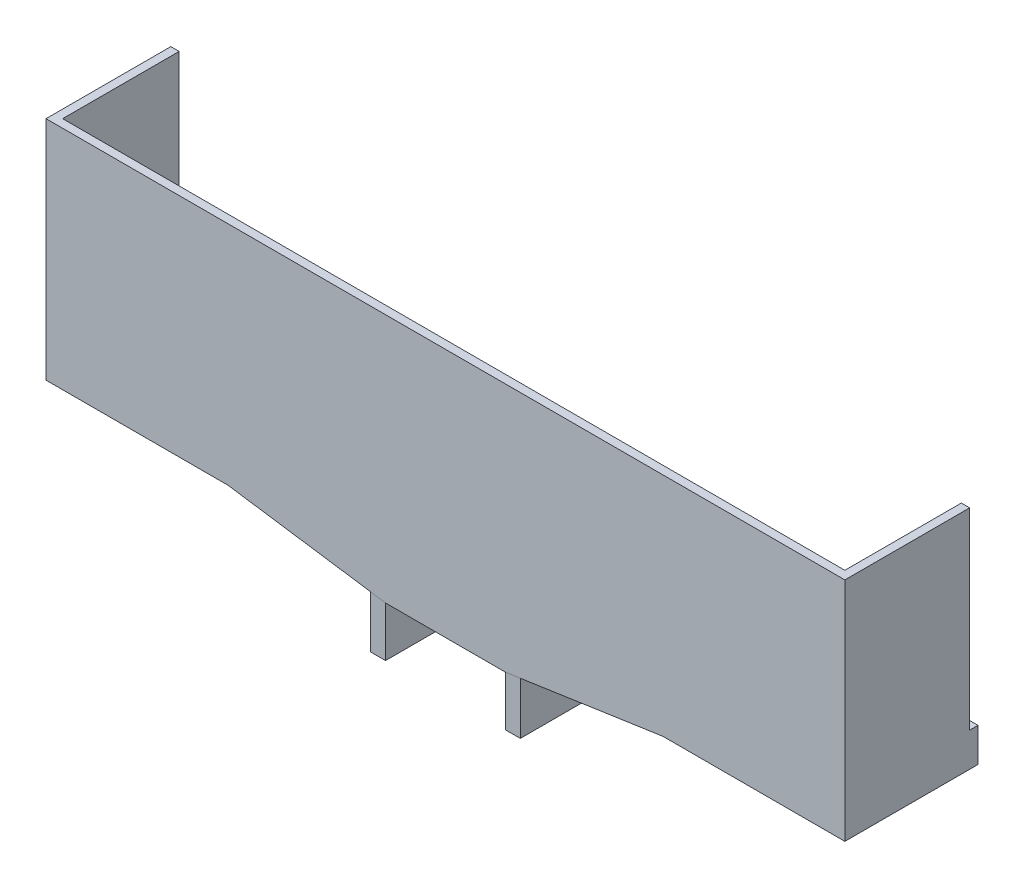
ISO-10303-21;
HEADER;
FILE_DESCRIPTION(('STEP AP214'),'2;1');
FILE_NAME('part.step','',(''),(''),'','','');
FILE_SCHEMA(('AUTOMOTIVE_DESIGN { 1 0 10303 214 1 1 1 1 }'));
ENDSEC;
DATA;
#1=APPLICATION_CONTEXT('core data for automotive mechanical design processes');
#2=APPLICATION_PROTOCOL_DEFINITION('international standard','automotive_design',2000,#1);
#3=PRODUCT_CONTEXT('',#1,'mechanical');
#4=PRODUCT('Part','Part','',(#3));
#5=PRODUCT_RELATED_PRODUCT_CATEGORY('part','',(#4));
#6=PRODUCT_DEFINITION_FORMATION('','',#4);
#7=PRODUCT_DEFINITION_CONTEXT('part definition',#1,'design');
#8=PRODUCT_DEFINITION('design','',#6,#7);
#9=PRODUCT_DEFINITION_SHAPE('','',#8);
#10=(LENGTH_UNIT() NAMED_UNIT(*) SI_UNIT(.MILLI.,.METRE.));
#11=(NAMED_UNIT(*) PLANE_ANGLE_UNIT() SI_UNIT($,.RADIAN.));
#12=(NAMED_UNIT(*) SI_UNIT($,.STERADIAN.) SOLID_ANGLE_UNIT());
#13=UNCERTAINTY_MEASURE_WITH_UNIT(LENGTH_MEASURE(1.E-05),#10,'distance_accuracy_value','');
#14=(GEOMETRIC_REPRESENTATION_CONTEXT(3) GLOBAL_UNCERTAINTY_ASSIGNED_CONTEXT((#13)) GLOBAL_UNIT_ASSIGNED_CONTEXT((#10,
#11,#12)) REPRESENTATION_CONTEXT('',''));
#15=CARTESIAN_POINT('',(0.,0.,0.));
#16=DIRECTION('',(0.,0.,1.));
#17=DIRECTION('',(1.,0.,0.));
#18=AXIS2_PLACEMENT_3D('',#15,#16,#17);
#19=CARTESIAN_POINT('',(240.,30.,80.));
#20=DIRECTION('',(-0.145493990494832,0.989359135364853,0.));
#21=DIRECTION('',(-0.989359135364853,-0.145493990494832,0.));
#22=AXIS2_PLACEMENT_3D('',#19,#20,#21);
#23=PLANE('',#22);
#24=DIRECTION('',(0.,0.,-1.));
#25=VECTOR('',#24,1.);
#26=CARTESIAN_POINT('',(36.,0.,0.));
#27=LINE('',#26,#25);
#28=CARTESIAN_POINT('',(36.,0.,80.));
#29=VERTEX_POINT('',#28);
#30=CARTESIAN_POINT('',(36.,0.,40.));
#31=VERTEX_POINT('',#30);
#32=EDGE_CURVE('E104',#29,#31,#27,.T.);
#33=ORIENTED_EDGE('',*,*,#32,.F.);
#34=DIRECTION('',(0.989359135364853,0.145493990494832,0.));
#35=VECTOR('',#34,1.);
#36=CARTESIAN_POINT('',(22.3542252328534,-2.00673158340392,80.));
#37=LINE('',#36,#35);
#38=CARTESIAN_POINT('',(45.,1.32352941176474,80.));
#39=VERTEX_POINT('',#38);
#40=EDGE_CURVE('E12',#29,#39,#37,.T.);
#41=ORIENTED_EDGE('',*,*,#40,.T.);
#42=DIRECTION('',(0.,0.,-1.));
#43=VECTOR('',#42,1.);
#44=CARTESIAN_POINT('',(45.,1.3235294117647,0.));
#45=LINE('',#44,#43);
#46=CARTESIAN_POINT('',(45.,1.32352941176475,40.));
#47=VERTEX_POINT('',#46);
#48=EDGE_CURVE('E53',#39,#47,#45,.T.);
#49=ORIENTED_EDGE('',*,*,#48,.T.);
#50=DIRECTION('',(0.989359135364853,0.145493990494832,0.));
#51=VECTOR('',#50,1.);
#52=CARTESIAN_POINT('',(22.3542252328535,-2.00673158340392,40.));
#53=LINE('',#52,#51);
#54=EDGE_CURVE('E48',#31,#47,#53,.T.);
#55=ORIENTED_EDGE('',*,*,#54,.F.);
#56=EDGE_LOOP('',(#33,#41,#49,#55));
#57=FACE_BOUND('',#56,.T.);
#58=ADVANCED_FACE('F45',(#57),#23,.T.);
#59=CARTESIAN_POINT('',(-1.50463529560101E-13,150.002,79.9999999999999));
#60=DIRECTION('',(0.,0.,-1.));
#61=DIRECTION('',(-1.,0.,0.));
#62=AXIS2_PLACEMENT_3D('',#59,#60,#61);
#63=PLANE('',#62);
#64=ORIENTED_EDGE('',*,*,#40,.F.);
#65=DIRECTION('',(0.,1.,0.));
#66=VECTOR('',#65,1.);
#67=CARTESIAN_POINT('',(36.,-30.,80.));
#68=LINE('',#67,#66);
#69=CARTESIAN_POINT('',(36.,-30.,80.));
#70=VERTEX_POINT('',#69);
#71=EDGE_CURVE('E105',#70,#29,#68,.T.);
#72=ORIENTED_EDGE('',*,*,#71,.F.);
#73=DIRECTION('',(1.,0.,0.));
#74=VECTOR('',#73,1.);
#75=CARTESIAN_POINT('',(-1.17937102984812E-13,-30.,79.9999999999999));
#76=LINE('',#75,#74);
#77=CARTESIAN_POINT('',(45.,-30.,80.));
#78=VERTEX_POINT('',#77);
#79=EDGE_CURVE('E99',#70,#78,#76,.T.);
#80=ORIENTED_EDGE('',*,*,#79,.T.);
#81=DIRECTION('',(0.,-1.,0.));
#82=VECTOR('',#81,1.);
#83=CARTESIAN_POINT('',(45.,150.002,80.));
#84=LINE('',#83,#82);
#85=EDGE_CURVE('E107',#39,#78,#84,.T.);
#86=ORIENTED_EDGE('',*,*,#85,.F.);
#87=EDGE_LOOP('',(#64,#72,#80,#86));
#88=FACE_BOUND('',#87,.T.);
#89=ADVANCED_FACE('F119',(#88),#63,.F.);
#90=CARTESIAN_POINT('',(44.9999999999999,150.002,0.));
#91=DIRECTION('',(-1.,0.,0.));
#92=DIRECTION('',(0.,0.,1.));
#93=AXIS2_PLACEMENT_3D('',#90,#91,#92);
#94=PLANE('',#93);
#95=ORIENTED_EDGE('',*,*,#48,.F.);
#96=ORIENTED_EDGE('',*,*,#85,.T.);
#97=DIRECTION('',(0.,0.,-1.));
#98=VECTOR('',#97,1.);
#99=CARTESIAN_POINT('',(45.,-30.,0.));
#100=LINE('',#99,#98);
#101=CARTESIAN_POINT('',(45.,-30.,40.));
#102=VERTEX_POINT('',#101);
#103=EDGE_CURVE('E92',#78,#102,#100,.T.);
#104=ORIENTED_EDGE('',*,*,#103,.T.);
#105=DIRECTION('',(0.,-1.,0.));
#106=VECTOR('',#105,1.);
#107=CARTESIAN_POINT('',(45.,150.002,40.));
#108=LINE('',#107,#106);
#109=EDGE_CURVE('E88',#47,#102,#108,.T.);
#110=ORIENTED_EDGE('',*,*,#109,.F.);
#111=EDGE_LOOP('',(#95,#96,#104,#110));
#112=FACE_BOUND('',#111,.T.);
#113=ADVANCED_FACE('F116',(#112),#94,.F.);
#114=CARTESIAN_POINT('',(0.,150.002,39.9999999999999));
#115=DIRECTION('',(0.,0.,-1.));
#116=DIRECTION('',(-1.,0.,0.));
#117=AXIS2_PLACEMENT_3D('',#114,#115,#116);
#118=PLANE('',#117);
#119=ORIENTED_EDGE('',*,*,#109,.T.);
#120=DIRECTION('',(1.,0.,0.));
#121=VECTOR('',#120,1.);
#122=CARTESIAN_POINT('',(0.,-30.,39.9999999999999));
#123=LINE('',#122,#121);
#124=CARTESIAN_POINT('',(36.,-30.,40.));
#125=VERTEX_POINT('',#124);
#126=EDGE_CURVE('E82',#125,#102,#123,.T.);
#127=ORIENTED_EDGE('',*,*,#126,.F.);
#128=DIRECTION('',(0.,1.,0.));
#129=VECTOR('',#128,1.);
#130=CARTESIAN_POINT('',(36.,-30.,40.));
#131=LINE('',#130,#129);
#132=EDGE_CURVE('E86',#125,#31,#131,.T.);
#133=ORIENTED_EDGE('',*,*,#132,.T.);
#134=ORIENTED_EDGE('',*,*,#54,.T.);
#135=EDGE_LOOP('',(#119,#127,#133,#134));
#136=FACE_BOUND('',#135,.T.);
#137=ADVANCED_FACE('F84',(#136),#118,.T.);
#138=CARTESIAN_POINT('',(36.,-30.,0.));
#139=DIRECTION('',(1.,0.,0.));
#140=DIRECTION('',(0.,1.,0.));
#141=AXIS2_PLACEMENT_3D('',#138,#139,#140);
#142=PLANE('',#141);
#143=ORIENTED_EDGE('',*,*,#32,.T.);
#144=ORIENTED_EDGE('',*,*,#132,.F.);
#145=DIRECTION('',(0.,0.,-1.));
#146=VECTOR('',#145,1.);
#147=CARTESIAN_POINT('',(36.,-30.,0.));
#148=LINE('',#147,#146);
#149=EDGE_CURVE('E93',#70,#125,#148,.T.);
#150=ORIENTED_EDGE('',*,*,#149,.F.);
#151=ORIENTED_EDGE('',*,*,#71,.T.);
#152=EDGE_LOOP('',(#143,#144,#150,#151));
#153=FACE_BOUND('',#152,.T.);
#154=ADVANCED_FACE('F102',(#153),#142,.F.);
#155=CARTESIAN_POINT('',(0.,-30.,0.));
#156=DIRECTION('',(0.,-1.,0.));
#157=DIRECTION('',(1.,0.,0.));
#158=AXIS2_PLACEMENT_3D('',#155,#156,#157);
#159=PLANE('',#158);
#160=ORIENTED_EDGE('',*,*,#149,.T.);
#161=ORIENTED_EDGE('',*,*,#126,.T.);
#162=ORIENTED_EDGE('',*,*,#103,.F.);
#163=ORIENTED_EDGE('',*,*,#79,.F.);
#164=EDGE_LOOP('',(#160,#161,#162,#163));
#165=FACE_BOUND('',#164,.T.);
#166=ADVANCED_FACE('F97',(#165),#159,.T.);
#167=CLOSED_SHELL('',(#58,#89,#113,#137,#154,#166));
#168=MANIFOLD_SOLID_BREP('B2',#167);
#169=CARTESIAN_POINT('',(-36.,0.,80.));
#170=DIRECTION('',(0.145493990494831,0.989359135364853,0.));
#171=DIRECTION('',(-0.989359135364853,0.145493990494831,0.));
#172=AXIS2_PLACEMENT_3D('',#169,#170,#171);
#173=PLANE('',#172);
#174=DIRECTION('',(0.989359135364853,-0.145493990494831,0.));
#175=VECTOR('',#174,1.);
#176=CARTESIAN_POINT('',(-22.3542252328535,-2.00673158340386,80.));
#177=LINE('',#176,#175);
#178=CARTESIAN_POINT('',(-45.,1.32352941176475,80.));
#179=VERTEX_POINT('',#178);
#180=CARTESIAN_POINT('',(-36.,0.,80.));
#181=VERTEX_POINT('',#180);
#182=EDGE_CURVE('E191',#179,#181,#177,.T.);
#183=ORIENTED_EDGE('',*,*,#182,.T.);
#184=DIRECTION('',(0.,0.,-1.));
#185=VECTOR('',#184,1.);
#186=CARTESIAN_POINT('',(-36.,0.,0.));
#187=LINE('',#186,#185);
#188=CARTESIAN_POINT('',(-36.,0.,40.));
#189=VERTEX_POINT('',#188);
#190=EDGE_CURVE('E43',#181,#189,#187,.T.);
#191=ORIENTED_EDGE('',*,*,#190,.T.);
#192=DIRECTION('',(0.989359135364853,-0.145493990494831,0.));
#193=VECTOR('',#192,1.);
#194=CARTESIAN_POINT('',(-22.3542252328535,-2.00673158340386,40.));
#195=LINE('',#194,#193);
#196=CARTESIAN_POINT('',(-45.,1.32352941176477,40.));
#197=VERTEX_POINT('',#196);
#198=EDGE_CURVE('E251',#197,#189,#195,.T.);
#199=ORIENTED_EDGE('',*,*,#198,.F.);
#200=DIRECTION('',(0.,0.,-1.));
#201=VECTOR('',#200,1.);
#202=CARTESIAN_POINT('',(-45.,1.3235294117647,0.));
#203=LINE('',#202,#201);
#204=EDGE_CURVE('E186',#179,#197,#203,.T.);
#205=ORIENTED_EDGE('',*,*,#204,.F.);
#206=EDGE_LOOP('',(#183,#191,#199,#205));
#207=FACE_BOUND('',#206,.T.);
#208=ADVANCED_FACE('F183',(#207),#173,.T.);
#209=CARTESIAN_POINT('',(0.,150.002,40.));
#210=DIRECTION('',(0.,0.,-1.));
#211=DIRECTION('',(-1.,0.,0.));
#212=AXIS2_PLACEMENT_3D('',#209,#210,#211);
#213=PLANE('',#212);
#214=DIRECTION('',(0.,-1.,0.));
#215=VECTOR('',#214,1.);
#216=CARTESIAN_POINT('',(-45.,150.002,40.));
#217=LINE('',#216,#215);
#218=CARTESIAN_POINT('',(-45.,-30.,40.));
#219=VERTEX_POINT('',#218);
#220=EDGE_CURVE('E227',#197,#219,#217,.T.);
#221=ORIENTED_EDGE('',*,*,#220,.F.);
#222=ORIENTED_EDGE('',*,*,#198,.T.);
#223=DIRECTION('',(0.,1.,0.));
#224=VECTOR('',#223,1.);
#225=CARTESIAN_POINT('',(-36.,-30.,40.));
#226=LINE('',#225,#224);
#227=CARTESIAN_POINT('',(-36.,-30.,40.));
#228=VERTEX_POINT('',#227);
#229=EDGE_CURVE('E228',#228,#189,#226,.T.);
#230=ORIENTED_EDGE('',*,*,#229,.F.);
#231=DIRECTION('',(1.,0.,0.));
#232=VECTOR('',#231,1.);
#233=CARTESIAN_POINT('',(0.,-30.,40.));
#234=LINE('',#233,#232);
#235=EDGE_CURVE('E236',#219,#228,#234,.T.);
#236=ORIENTED_EDGE('',*,*,#235,.F.);
#237=EDGE_LOOP('',(#221,#222,#230,#236));
#238=FACE_BOUND('',#237,.T.);
#239=ADVANCED_FACE('F257',(#238),#213,.T.);
#240=CARTESIAN_POINT('',(-45.,150.002,0.));
#241=DIRECTION('',(-1.,0.,0.));
#242=DIRECTION('',(0.,0.,1.));
#243=AXIS2_PLACEMENT_3D('',#240,#241,#242);
#244=PLANE('',#243);
#245=DIRECTION('',(0.,-1.,0.));
#246=VECTOR('',#245,1.);
#247=CARTESIAN_POINT('',(-45.,150.002,80.));
#248=LINE('',#247,#246);
#249=CARTESIAN_POINT('',(-45.,-30.,80.));
#250=VERTEX_POINT('',#249);
#251=EDGE_CURVE('E241',#179,#250,#248,.T.);
#252=ORIENTED_EDGE('',*,*,#251,.F.);
#253=ORIENTED_EDGE('',*,*,#204,.T.);
#254=ORIENTED_EDGE('',*,*,#220,.T.);
#255=DIRECTION('',(0.,0.,-1.));
#256=VECTOR('',#255,1.);
#257=CARTESIAN_POINT('',(-45.,-30.,0.));
#258=LINE('',#257,#256);
#259=EDGE_CURVE('E243',#250,#219,#258,.T.);
#260=ORIENTED_EDGE('',*,*,#259,.F.);
#261=EDGE_LOOP('',(#252,#253,#254,#260));
#262=FACE_BOUND('',#261,.T.);
#263=ADVANCED_FACE('F256',(#262),#244,.T.);
#264=CARTESIAN_POINT('',(0.,150.002,80.));
#265=DIRECTION('',(0.,0.,-1.));
#266=DIRECTION('',(-1.,0.,0.));
#267=AXIS2_PLACEMENT_3D('',#264,#265,#266);
#268=PLANE('',#267);
#269=ORIENTED_EDGE('',*,*,#182,.F.);
#270=ORIENTED_EDGE('',*,*,#251,.T.);
#271=DIRECTION('',(1.,0.,0.));
#272=VECTOR('',#271,1.);
#273=CARTESIAN_POINT('',(0.,-30.,80.));
#274=LINE('',#273,#272);
#275=CARTESIAN_POINT('',(-36.,-30.,80.));
#276=VERTEX_POINT('',#275);
#277=EDGE_CURVE('E234',#250,#276,#274,.T.);
#278=ORIENTED_EDGE('',*,*,#277,.T.);
#279=DIRECTION('',(0.,1.,0.));
#280=VECTOR('',#279,1.);
#281=CARTESIAN_POINT('',(-36.,-30.,80.));
#282=LINE('',#281,#280);
#283=EDGE_CURVE('E220',#276,#181,#282,.T.);
#284=ORIENTED_EDGE('',*,*,#283,.T.);
#285=EDGE_LOOP('',(#269,#270,#278,#284));
#286=FACE_BOUND('',#285,.T.);
#287=ADVANCED_FACE('F239',(#286),#268,.F.);
#288=CARTESIAN_POINT('',(-36.,-30.,0.));
#289=DIRECTION('',(1.,0.,0.));
#290=DIRECTION('',(0.,1.,0.));
#291=AXIS2_PLACEMENT_3D('',#288,#289,#290);
#292=PLANE('',#291);
#293=ORIENTED_EDGE('',*,*,#190,.F.);
#294=ORIENTED_EDGE('',*,*,#283,.F.);
#295=DIRECTION('',(0.,0.,-1.));
#296=VECTOR('',#295,1.);
#297=CARTESIAN_POINT('',(-36.,-30.,0.));
#298=LINE('',#297,#296);
#299=EDGE_CURVE('E224',#276,#228,#298,.T.);
#300=ORIENTED_EDGE('',*,*,#299,.T.);
#301=ORIENTED_EDGE('',*,*,#229,.T.);
#302=EDGE_LOOP('',(#293,#294,#300,#301));
#303=FACE_BOUND('',#302,.T.);
#304=ADVANCED_FACE('F222',(#303),#292,.T.);
#305=CARTESIAN_POINT('',(0.,-30.,0.));
#306=DIRECTION('',(0.,-1.,0.));
#307=DIRECTION('',(1.,0.,0.));
#308=AXIS2_PLACEMENT_3D('',#305,#306,#307);
#309=PLANE('',#308);
#310=ORIENTED_EDGE('',*,*,#299,.F.);
#311=ORIENTED_EDGE('',*,*,#277,.F.);
#312=ORIENTED_EDGE('',*,*,#259,.T.);
#313=ORIENTED_EDGE('',*,*,#235,.T.);
#314=EDGE_LOOP('',(#310,#311,#312,#313));
#315=FACE_BOUND('',#314,.T.);
#316=ADVANCED_FACE('F232',(#315),#309,.T.);
#317=CLOSED_SHELL('',(#208,#239,#263,#287,#304,#316));
#318=MANIFOLD_SOLID_BREP('B6',#317);
#319=CARTESIAN_POINT('',(0.,0.,0.));
#320=DIRECTION('',(0.,0.,-1.));
#321=DIRECTION('',(-1.,0.,0.));
#322=AXIS2_PLACEMENT_3D('',#319,#320,#321);
#323=PLANE('',#322);
#324=DIRECTION('',(0.,-1.,0.));
#325=VECTOR('',#324,1.);
#326=CARTESIAN_POINT('',(36.,5.05377655218812,0.));
#327=LINE('',#326,#325);
#328=CARTESIAN_POINT('',(36.,1.49870614995921,0.));
#329=VERTEX_POINT('',#328);
#330=CARTESIAN_POINT('',(36.,0.,0.));
#331=VERTEX_POINT('',#330);
#332=EDGE_CURVE('E502',#329,#331,#327,.T.);
#333=ORIENTED_EDGE('',*,*,#332,.F.);
#334=DIRECTION('',(-0.596702766344558,-0.802462340946136,0.));
#335=VECTOR('',#334,1.);
#336=CARTESIAN_POINT('',(22.4644213989824,-16.7043133479611,0.));
#337=LINE('',#336,#335);
#338=CARTESIAN_POINT('',(38.9680774060946,5.49025852367262,0.));
#339=VERTEX_POINT('',#338);
#340=EDGE_CURVE('E335',#329,#339,#337,.F.);
#341=ORIENTED_EDGE('',*,*,#340,.T.);
#342=DIRECTION('',(-0.989359135364853,-0.145493990494832,0.));
#343=VECTOR('',#342,1.);
#344=CARTESIAN_POINT('',(36.,5.05377655218812,0.));
#345=LINE('',#344,#343);
#346=CARTESIAN_POINT('',(235.,34.3184824345411,0.));
#347=VERTEX_POINT('',#346);
#348=EDGE_CURVE('E504',#347,#339,#345,.T.);
#349=ORIENTED_EDGE('',*,*,#348,.F.);
#350=DIRECTION('',(-1.,0.,0.));
#351=VECTOR('',#350,1.);
#352=CARTESIAN_POINT('',(240.,34.3184824345411,0.));
#353=LINE('',#352,#351);
#354=CARTESIAN_POINT('',(240.,34.3184824345411,0.));
#355=VERTEX_POINT('',#354);
#356=EDGE_CURVE('E485',#355,#347,#353,.T.);
#357=ORIENTED_EDGE('',*,*,#356,.F.);
#358=DIRECTION('',(0.,1.,0.));
#359=VECTOR('',#358,1.);
#360=CARTESIAN_POINT('',(240.,30.,0.));
#361=LINE('',#360,#359);
#362=CARTESIAN_POINT('',(240.,13.925,0.));
#363=VERTEX_POINT('',#362);
#364=EDGE_CURVE('E462',#363,#355,#361,.T.);
#365=ORIENTED_EDGE('',*,*,#364,.F.);
#366=DIRECTION('',(-1.,0.,0.));
#367=VECTOR('',#366,1.);
#368=CARTESIAN_POINT('',(130.69,13.925,0.));
#369=LINE('',#368,#367);
#370=CARTESIAN_POINT('',(130.69,13.925,0.));
#371=VERTEX_POINT('',#370);
#372=EDGE_CURVE('E487',#363,#371,#369,.T.);
#373=ORIENTED_EDGE('',*,*,#372,.T.);
#374=DIRECTION('',(0.989359135364853,0.145493990494832,0.));
#375=VECTOR('',#374,1.);
#376=CARTESIAN_POINT('',(240.,30.,0.));
#377=LINE('',#376,#375);
#378=EDGE_CURVE('E566',#331,#371,#377,.T.);
#379=ORIENTED_EDGE('',*,*,#378,.F.);
#380=EDGE_LOOP('',(#333,#341,#349,#357,#365,#373,#379));
#381=FACE_BOUND('',#380,.T.);
#382=ADVANCED_FACE('F312',(#381),#323,.T.);
#383=CARTESIAN_POINT('',(36.,0.,80.));
#384=DIRECTION('',(0.,1.,0.));
#385=DIRECTION('',(-1.,0.,0.));
#386=AXIS2_PLACEMENT_3D('',#383,#384,#385);
#387=PLANE('',#386);
#388=DIRECTION('',(0.,0.,-1.));
#389=VECTOR('',#388,1.);
#390=CARTESIAN_POINT('',(-36.,0.,80.));
#391=LINE('',#390,#389);
#392=CARTESIAN_POINT('',(-36.,0.,80.));
#393=VERTEX_POINT('',#392);
#394=CARTESIAN_POINT('',(-36.,0.,75.));
#395=VERTEX_POINT('',#394);
#396=EDGE_CURVE('E587',#393,#395,#391,.T.);
#397=ORIENTED_EDGE('',*,*,#396,.T.);
#398=DIRECTION('',(1.,0.,0.));
#399=VECTOR('',#398,1.);
#400=CARTESIAN_POINT('',(-36.,0.,75.));
#401=LINE('',#400,#399);
#402=CARTESIAN_POINT('',(36.,0.,75.));
#403=VERTEX_POINT('',#402);
#404=EDGE_CURVE('E530',#395,#403,#401,.T.);
#405=ORIENTED_EDGE('',*,*,#404,.T.);
#406=DIRECTION('',(0.,0.,-1.));
#407=VECTOR('',#406,1.);
#408=CARTESIAN_POINT('',(36.,0.,80.));
#409=LINE('',#408,#407);
#410=CARTESIAN_POINT('',(36.,0.,80.));
#411=VERTEX_POINT('',#410);
#412=EDGE_CURVE('E596',#411,#403,#409,.T.);
#413=ORIENTED_EDGE('',*,*,#412,.F.);
#414=DIRECTION('',(1.,0.,0.));
#415=VECTOR('',#414,1.);
#416=CARTESIAN_POINT('',(36.,0.,80.));
#417=LINE('',#416,#415);
#418=EDGE_CURVE('E567',#393,#411,#417,.T.);
#419=ORIENTED_EDGE('',*,*,#418,.F.);
#420=EDGE_LOOP('',(#397,#405,#413,#419));
#421=FACE_BOUND('',#420,.T.);
#422=ADVANCED_FACE('F635',(#421),#387,.F.);
#423=CARTESIAN_POINT('',(240.,30.,80.));
#424=DIRECTION('',(-0.145493990494832,0.989359135364853,0.));
#425=DIRECTION('',(-0.989359135364853,-0.145493990494832,0.));
#426=AXIS2_PLACEMENT_3D('',#423,#424,#425);
#427=PLANE('',#426);
#428=ORIENTED_EDGE('',*,*,#378,.T.);
#429=DIRECTION('',(0.,0.,-1.));
#430=VECTOR('',#429,1.);
#431=CARTESIAN_POINT('',(130.69,13.925,190.485662983937));
#432=LINE('',#431,#430);
#433=CARTESIAN_POINT('',(130.69,13.925,80.));
#434=VERTEX_POINT('',#433);
#435=EDGE_CURVE('E486',#434,#371,#432,.T.);
#436=ORIENTED_EDGE('',*,*,#435,.F.);
#437=DIRECTION('',(0.989359135364853,0.145493990494832,0.));
#438=VECTOR('',#437,1.);
#439=CARTESIAN_POINT('',(240.,30.,80.));
#440=LINE('',#439,#438);
#441=EDGE_CURVE('E570',#411,#434,#440,.T.);
#442=ORIENTED_EDGE('',*,*,#441,.F.);
#443=ORIENTED_EDGE('',*,*,#412,.T.);
#444=EDGE_CURVE('E595',#403,#331,#409,.T.);
#445=ORIENTED_EDGE('',*,*,#444,.T.);
#446=EDGE_LOOP('',(#428,#436,#442,#443,#445));
#447=FACE_BOUND('',#446,.T.);
#448=ADVANCED_FACE('F666',(#447),#427,.F.);
#449=CARTESIAN_POINT('',(240.,30.,80.));
#450=DIRECTION('',(-1.,0.,0.));
#451=DIRECTION('',(0.,-1.,0.));
#452=AXIS2_PLACEMENT_3D('',#449,#450,#451);
#453=PLANE('',#452);
#454=DIRECTION('',(0.,0.,-1.));
#455=VECTOR('',#454,1.);
#456=CARTESIAN_POINT('',(240.,34.3184824345411,507.891638427206));
#457=LINE('',#456,#455);
#458=CARTESIAN_POINT('',(240.,34.3184824345411,5.));
#459=VERTEX_POINT('',#458);
#460=EDGE_CURVE('E514',#459,#355,#457,.T.);
#461=ORIENTED_EDGE('',*,*,#460,.F.);
#462=DIRECTION('',(0.,-1.,0.));
#463=VECTOR('',#462,1.);
#464=CARTESIAN_POINT('',(240.,150.,5.));
#465=LINE('',#464,#463);
#466=CARTESIAN_POINT('',(240.,150.,5.));
#467=VERTEX_POINT('',#466);
#468=EDGE_CURVE('E511',#467,#459,#465,.T.);
#469=ORIENTED_EDGE('',*,*,#468,.F.);
#470=DIRECTION('',(0.,0.,-1.));
#471=VECTOR('',#470,1.);
#472=CARTESIAN_POINT('',(240.,150.,80.));
#473=LINE('',#472,#471);
#474=CARTESIAN_POINT('',(240.,150.,80.));
#475=VERTEX_POINT('',#474);
#476=EDGE_CURVE('E592',#475,#467,#473,.T.);
#477=ORIENTED_EDGE('',*,*,#476,.F.);
#478=DIRECTION('',(0.,1.,0.));
#479=VECTOR('',#478,1.);
#480=CARTESIAN_POINT('',(240.,30.,80.));
#481=LINE('',#480,#479);
#482=CARTESIAN_POINT('',(240.,13.925,80.));
#483=VERTEX_POINT('',#482);
#484=EDGE_CURVE('E573',#483,#475,#481,.T.);
#485=ORIENTED_EDGE('',*,*,#484,.F.);
#486=DIRECTION('',(0.,0.,-1.));
#487=VECTOR('',#486,1.);
#488=CARTESIAN_POINT('',(240.,13.925,190.485662983937));
#489=LINE('',#488,#487);
#490=EDGE_CURVE('E490',#483,#363,#489,.T.);
#491=ORIENTED_EDGE('',*,*,#490,.T.);
#492=ORIENTED_EDGE('',*,*,#364,.T.);
#493=EDGE_LOOP('',(#461,#469,#477,#485,#491,#492));
#494=FACE_BOUND('',#493,.T.);
#495=ADVANCED_FACE('F674',(#494),#453,.F.);
#496=CARTESIAN_POINT('',(-240.,150.,80.));
#497=DIRECTION('',(0.,-1.,0.));
#498=DIRECTION('',(1.,0.,0.));
#499=AXIS2_PLACEMENT_3D('',#496,#497,#498);
#500=PLANE('',#499);
#501=ORIENTED_EDGE('',*,*,#476,.T.);
#502=DIRECTION('',(1.,0.,0.));
#503=VECTOR('',#502,1.);
#504=CARTESIAN_POINT('',(240.,150.,5.));
#505=LINE('',#504,#503);
#506=CARTESIAN_POINT('',(235.,150.,5.));
#507=VERTEX_POINT('',#506);
#508=EDGE_CURVE('E517',#507,#467,#505,.T.);
#509=ORIENTED_EDGE('',*,*,#508,.F.);
#510=DIRECTION('',(0.,0.,-1.));
#511=VECTOR('',#510,1.);
#512=CARTESIAN_POINT('',(235.,150.,75.));
#513=LINE('',#512,#511);
#514=CARTESIAN_POINT('',(235.,150.,75.));
#515=VERTEX_POINT('',#514);
#516=EDGE_CURVE('E560',#515,#507,#513,.T.);
#517=ORIENTED_EDGE('',*,*,#516,.F.);
#518=DIRECTION('',(-1.,0.,0.));
#519=VECTOR('',#518,1.);
#520=CARTESIAN_POINT('',(235.,150.,75.));
#521=LINE('',#520,#519);
#522=CARTESIAN_POINT('',(-235.,150.,75.));
#523=VERTEX_POINT('',#522);
#524=EDGE_CURVE('E541',#515,#523,#521,.T.);
#525=ORIENTED_EDGE('',*,*,#524,.T.);
#526=DIRECTION('',(0.,0.,-1.));
#527=VECTOR('',#526,1.);
#528=CARTESIAN_POINT('',(-235.,150.,75.));
#529=LINE('',#528,#527);
#530=CARTESIAN_POINT('',(-235.,150.,5.));
#531=VERTEX_POINT('',#530);
#532=EDGE_CURVE('E557',#523,#531,#529,.T.);
#533=ORIENTED_EDGE('',*,*,#532,.T.);
#534=CARTESIAN_POINT('',(-240.,150.,5.));
#535=VERTEX_POINT('',#534);
#536=EDGE_CURVE('E515',#535,#531,#505,.T.);
#537=ORIENTED_EDGE('',*,*,#536,.F.);
#538=DIRECTION('',(0.,0.,-1.));
#539=VECTOR('',#538,1.);
#540=CARTESIAN_POINT('',(-240.,150.,80.));
#541=LINE('',#540,#539);
#542=CARTESIAN_POINT('',(-240.,150.,80.));
#543=VERTEX_POINT('',#542);
#544=EDGE_CURVE('E590',#543,#535,#541,.T.);
#545=ORIENTED_EDGE('',*,*,#544,.F.);
#546=DIRECTION('',(-1.,0.,0.));
#547=VECTOR('',#546,1.);
#548=CARTESIAN_POINT('',(-240.,150.,80.));
#549=LINE('',#548,#547);
#550=EDGE_CURVE('E575',#475,#543,#549,.T.);
#551=ORIENTED_EDGE('',*,*,#550,.F.);
#552=EDGE_LOOP('',(#501,#509,#517,#525,#533,#537,#545,#551));
#553=FACE_BOUND('',#552,.T.);
#554=ADVANCED_FACE('F642',(#553),#500,.F.);
#555=CARTESIAN_POINT('',(-240.,30.,80.));
#556=DIRECTION('',(1.,0.,0.));
#557=DIRECTION('',(0.,1.,0.));
#558=AXIS2_PLACEMENT_3D('',#555,#556,#557);
#559=PLANE('',#558);
#560=ORIENTED_EDGE('',*,*,#544,.T.);
#561=DIRECTION('',(0.,1.,0.));
#562=VECTOR('',#561,1.);
#563=CARTESIAN_POINT('',(-240.,150.,5.));
#564=LINE('',#563,#562);
#565=CARTESIAN_POINT('',(-240.,34.3184824345411,5.));
#566=VERTEX_POINT('',#565);
#567=EDGE_CURVE('E518',#566,#535,#564,.T.);
#568=ORIENTED_EDGE('',*,*,#567,.F.);
#569=DIRECTION('',(0.,0.,-1.));
#570=VECTOR('',#569,1.);
#571=CARTESIAN_POINT('',(-240.,34.3184824345411,507.891638427206));
#572=LINE('',#571,#570);
#573=CARTESIAN_POINT('',(-240.,34.3184824345411,0.));
#574=VERTEX_POINT('',#573);
#575=EDGE_CURVE('E457',#566,#574,#572,.T.);
#576=ORIENTED_EDGE('',*,*,#575,.T.);
#577=DIRECTION('',(0.,-1.,0.));
#578=VECTOR('',#577,1.);
#579=CARTESIAN_POINT('',(-240.,30.,0.));
#580=LINE('',#579,#578);
#581=CARTESIAN_POINT('',(-240.,13.9250000000001,0.));
#582=VERTEX_POINT('',#581);
#583=EDGE_CURVE('E450',#574,#582,#580,.T.);
#584=ORIENTED_EDGE('',*,*,#583,.T.);
#585=DIRECTION('',(0.,0.,-1.));
#586=VECTOR('',#585,1.);
#587=CARTESIAN_POINT('',(-240.,13.9250000000001,190.485662983937));
#588=LINE('',#587,#586);
#589=CARTESIAN_POINT('',(-240.,13.9250000000001,80.));
#590=VERTEX_POINT('',#589);
#591=EDGE_CURVE('E455',#590,#582,#588,.T.);
#592=ORIENTED_EDGE('',*,*,#591,.F.);
#593=DIRECTION('',(0.,-1.,0.));
#594=VECTOR('',#593,1.);
#595=CARTESIAN_POINT('',(-240.,30.,80.));
#596=LINE('',#595,#594);
#597=EDGE_CURVE('E577',#543,#590,#596,.T.);
#598=ORIENTED_EDGE('',*,*,#597,.F.);
#599=EDGE_LOOP('',(#560,#568,#576,#584,#592,#598));
#600=FACE_BOUND('',#599,.T.);
#601=ADVANCED_FACE('F453',(#600),#559,.F.);
#602=CARTESIAN_POINT('',(-36.,0.,80.));
#603=DIRECTION('',(0.145493990494831,0.989359135364853,0.));
#604=DIRECTION('',(-0.989359135364853,0.145493990494831,0.));
#605=AXIS2_PLACEMENT_3D('',#602,#603,#604);
#606=PLANE('',#605);
#607=DIRECTION('',(0.989359135364853,-0.145493990494831,0.));
#608=VECTOR('',#607,1.);
#609=CARTESIAN_POINT('',(-36.,0.,80.));
#610=LINE('',#609,#608);
#611=CARTESIAN_POINT('',(-130.69,13.925,80.));
#612=VERTEX_POINT('',#611);
#613=EDGE_CURVE('E579',#612,#393,#610,.T.);
#614=ORIENTED_EDGE('',*,*,#613,.F.);
#615=DIRECTION('',(0.,0.,-1.));
#616=VECTOR('',#615,1.);
#617=CARTESIAN_POINT('',(-130.69,13.9250000000001,190.485662983937));
#618=LINE('',#617,#616);
#619=CARTESIAN_POINT('',(-130.69,13.9250000000001,0.));
#620=VERTEX_POINT('',#619);
#621=EDGE_CURVE('E472',#612,#620,#618,.T.);
#622=ORIENTED_EDGE('',*,*,#621,.T.);
#623=DIRECTION('',(0.989359135364853,-0.145493990494831,0.));
#624=VECTOR('',#623,1.);
#625=CARTESIAN_POINT('',(-36.,0.,0.));
#626=LINE('',#625,#624);
#627=CARTESIAN_POINT('',(-36.,0.,0.));
#628=VERTEX_POINT('',#627);
#629=EDGE_CURVE('E461',#620,#628,#626,.T.);
#630=ORIENTED_EDGE('',*,*,#629,.T.);
#631=EDGE_CURVE('E581',#395,#628,#391,.T.);
#632=ORIENTED_EDGE('',*,*,#631,.F.);
#633=ORIENTED_EDGE('',*,*,#396,.F.);
#634=EDGE_LOOP('',(#614,#622,#630,#632,#633));
#635=FACE_BOUND('',#634,.T.);
#636=ADVANCED_FACE('F630',(#635),#606,.F.);
#637=CARTESIAN_POINT('',(0.,0.,80.));
#638=DIRECTION('',(0.,0.,-1.));
#639=DIRECTION('',(-1.,0.,0.));
#640=AXIS2_PLACEMENT_3D('',#637,#638,#639);
#641=PLANE('',#640);
#642=ORIENTED_EDGE('',*,*,#418,.T.);
#643=ORIENTED_EDGE('',*,*,#441,.T.);
#644=DIRECTION('',(1.,0.,0.));
#645=VECTOR('',#644,1.);
#646=CARTESIAN_POINT('',(130.69,13.925,80.));
#647=LINE('',#646,#645);
#648=EDGE_CURVE('E482',#434,#483,#647,.T.);
#649=ORIENTED_EDGE('',*,*,#648,.T.);
#650=ORIENTED_EDGE('',*,*,#484,.T.);
#651=ORIENTED_EDGE('',*,*,#550,.T.);
#652=ORIENTED_EDGE('',*,*,#597,.T.);
#653=DIRECTION('',(1.,0.,0.));
#654=VECTOR('',#653,1.);
#655=CARTESIAN_POINT('',(-130.69,13.9250000000001,80.));
#656=LINE('',#655,#654);
#657=EDGE_CURVE('E471',#590,#612,#656,.T.);
#658=ORIENTED_EDGE('',*,*,#657,.T.);
#659=ORIENTED_EDGE('',*,*,#613,.T.);
#660=EDGE_LOOP('',(#642,#643,#649,#650,#651,#652,#658,#659));
#661=FACE_BOUND('',#660,.T.);
#662=ADVANCED_FACE('F637',(#661),#641,.F.);
#663=DIRECTION('',(-0.989359135364853,0.145493990494831,0.));
#664=VECTOR('',#663,1.);
#665=CARTESIAN_POINT('',(-235.,34.318482434541,0.));
#666=LINE('',#665,#664);
#667=CARTESIAN_POINT('',(-39.5172413793104,5.57101793149847,0.));
#668=VERTEX_POINT('',#667);
#669=CARTESIAN_POINT('',(-235.,34.318482434541,0.));
#670=VERTEX_POINT('',#669);
#671=EDGE_CURVE('E497',#668,#670,#666,.T.);
#672=ORIENTED_EDGE('',*,*,#671,.F.);
#673=DIRECTION('',(-0.707106781186542,0.707106781186553,0.));
#674=VECTOR('',#673,1.);
#675=CARTESIAN_POINT('',(-16.9731117239063,-16.973111723906,0.));
#676=LINE('',#675,#674);
#677=CARTESIAN_POINT('',(-36.,2.053776552188,0.));
#678=VERTEX_POINT('',#677);
#679=EDGE_CURVE('E602',#668,#678,#676,.F.);
#680=ORIENTED_EDGE('',*,*,#679,.T.);
#681=DIRECTION('',(0.,1.,0.));
#682=VECTOR('',#681,1.);
#683=CARTESIAN_POINT('',(-36.,0.,0.));
#684=LINE('',#683,#682);
#685=EDGE_CURVE('E499',#628,#678,#684,.T.);
#686=ORIENTED_EDGE('',*,*,#685,.F.);
#687=ORIENTED_EDGE('',*,*,#629,.F.);
#688=DIRECTION('',(-1.,0.,0.));
#689=VECTOR('',#688,1.);
#690=CARTESIAN_POINT('',(-130.69,13.9250000000001,0.));
#691=LINE('',#690,#689);
#692=EDGE_CURVE('E469',#620,#582,#691,.T.);
#693=ORIENTED_EDGE('',*,*,#692,.T.);
#694=ORIENTED_EDGE('',*,*,#583,.F.);
#695=DIRECTION('',(-1.,0.,0.));
#696=VECTOR('',#695,1.);
#697=CARTESIAN_POINT('',(-235.,34.318482434541,0.));
#698=LINE('',#697,#696);
#699=EDGE_CURVE('E494',#670,#574,#698,.T.);
#700=ORIENTED_EDGE('',*,*,#699,.F.);
#701=EDGE_LOOP('',(#672,#680,#686,#687,#693,#694,#700));
#702=FACE_BOUND('',#701,.T.);
#703=ADVANCED_FACE('F475',(#702),#323,.T.);
#704=CARTESIAN_POINT('',(36.,0.,75.));
#705=DIRECTION('',(-1.,0.,0.));
#706=DIRECTION('',(0.,0.,1.));
#707=AXIS2_PLACEMENT_3D('',#704,#705,#706);
#708=PLANE('',#707);
#709=DIRECTION('',(0.,1.,0.));
#710=VECTOR('',#709,1.);
#711=CARTESIAN_POINT('',(36.,0.,75.));
#712=LINE('',#711,#710);
#713=CARTESIAN_POINT('',(36.,1.49870614995921,75.));
#714=VERTEX_POINT('',#713);
#715=EDGE_CURVE('E533',#403,#714,#712,.T.);
#716=ORIENTED_EDGE('',*,*,#715,.T.);
#717=DIRECTION('',(0.,0.,-1.));
#718=VECTOR('',#717,1.);
#719=CARTESIAN_POINT('',(36.,1.49870614995921,75.));
#720=LINE('',#719,#718);
#721=EDGE_CURVE('E606',#714,#329,#720,.T.);
#722=ORIENTED_EDGE('',*,*,#721,.T.);
#723=ORIENTED_EDGE('',*,*,#332,.T.);
#724=ORIENTED_EDGE('',*,*,#444,.F.);
#725=EDGE_LOOP('',(#716,#722,#723,#724));
#726=FACE_BOUND('',#725,.T.);
#727=ADVANCED_FACE('F660',(#726),#708,.T.);
#728=CARTESIAN_POINT('',(36.,5.05377655218812,75.));
#729=DIRECTION('',(-0.145493990494832,0.989359135364853,0.));
#730=DIRECTION('',(-0.989359135364853,-0.145493990494832,0.));
#731=AXIS2_PLACEMENT_3D('',#728,#729,#730);
#732=PLANE('',#731);
#733=ORIENTED_EDGE('',*,*,#348,.T.);
#734=DIRECTION('',(0.,0.,1.));
#735=VECTOR('',#734,1.);
#736=CARTESIAN_POINT('',(38.9680774060946,5.49025852367262,75.));
#737=LINE('',#736,#735);
#738=CARTESIAN_POINT('',(38.9680774060946,5.49025852367262,75.));
#739=VERTEX_POINT('',#738);
#740=EDGE_CURVE('E327',#339,#739,#737,.T.);
#741=ORIENTED_EDGE('',*,*,#740,.T.);
#742=DIRECTION('',(0.989359135364853,0.145493990494832,0.));
#743=VECTOR('',#742,1.);
#744=CARTESIAN_POINT('',(36.,5.05377655218812,75.));
#745=LINE('',#744,#743);
#746=CARTESIAN_POINT('',(235.,34.3184824345411,75.));
#747=VERTEX_POINT('',#746);
#748=EDGE_CURVE('E537',#739,#747,#745,.T.);
#749=ORIENTED_EDGE('',*,*,#748,.T.);
#750=DIRECTION('',(0.,0.,-1.));
#751=VECTOR('',#750,1.);
#752=CARTESIAN_POINT('',(235.,34.3184824345411,75.));
#753=LINE('',#752,#751);
#754=CARTESIAN_POINT('',(235.,34.3184824345411,5.));
#755=VERTEX_POINT('',#754);
#756=EDGE_CURVE('E563',#747,#755,#753,.T.);
#757=ORIENTED_EDGE('',*,*,#756,.T.);
#758=DIRECTION('',(0.,0.,-1.));
#759=VECTOR('',#758,1.);
#760=CARTESIAN_POINT('',(235.,34.3184824345411,507.891638427206));
#761=LINE('',#760,#759);
#762=EDGE_CURVE('E510',#755,#347,#761,.T.);
#763=ORIENTED_EDGE('',*,*,#762,.T.);
#764=EDGE_LOOP('',(#733,#741,#749,#757,#763));
#765=FACE_BOUND('',#764,.T.);
#766=ADVANCED_FACE('F678',(#765),#732,.T.);
#767=CARTESIAN_POINT('',(235.,34.3184824345411,75.));
#768=DIRECTION('',(-1.,0.,0.));
#769=DIRECTION('',(0.,-1.,0.));
#770=AXIS2_PLACEMENT_3D('',#767,#768,#769);
#771=PLANE('',#770);
#772=DIRECTION('',(0.,1.,0.));
#773=VECTOR('',#772,1.);
#774=CARTESIAN_POINT('',(235.,34.3184824345411,5.));
#775=LINE('',#774,#773);
#776=EDGE_CURVE('E529',#755,#507,#775,.T.);
#777=ORIENTED_EDGE('',*,*,#776,.F.);
#778=ORIENTED_EDGE('',*,*,#756,.F.);
#779=DIRECTION('',(0.,1.,0.));
#780=VECTOR('',#779,1.);
#781=CARTESIAN_POINT('',(235.,34.3184824345411,75.));
#782=LINE('',#781,#780);
#783=EDGE_CURVE('E539',#747,#515,#782,.T.);
#784=ORIENTED_EDGE('',*,*,#783,.T.);
#785=ORIENTED_EDGE('',*,*,#516,.T.);
#786=EDGE_LOOP('',(#777,#778,#784,#785));
#787=FACE_BOUND('',#786,.T.);
#788=ADVANCED_FACE('F654',(#787),#771,.T.);
#789=CARTESIAN_POINT('',(-235.,150.,75.));
#790=DIRECTION('',(1.,0.,0.));
#791=DIRECTION('',(0.,1.,0.));
#792=AXIS2_PLACEMENT_3D('',#789,#790,#791);
#793=PLANE('',#792);
#794=DIRECTION('',(0.,-1.,0.));
#795=VECTOR('',#794,1.);
#796=CARTESIAN_POINT('',(-235.,150.,5.));
#797=LINE('',#796,#795);
#798=CARTESIAN_POINT('',(-235.,34.318482434541,5.));
#799=VERTEX_POINT('',#798);
#800=EDGE_CURVE('E534',#531,#799,#797,.T.);
#801=ORIENTED_EDGE('',*,*,#800,.F.);
#802=ORIENTED_EDGE('',*,*,#532,.F.);
#803=DIRECTION('',(0.,-1.,0.));
#804=VECTOR('',#803,1.);
#805=CARTESIAN_POINT('',(-235.,150.,75.));
#806=LINE('',#805,#804);
#807=CARTESIAN_POINT('',(-235.,34.318482434541,75.));
#808=VERTEX_POINT('',#807);
#809=EDGE_CURVE('E544',#523,#808,#806,.T.);
#810=ORIENTED_EDGE('',*,*,#809,.T.);
#811=DIRECTION('',(0.,0.,-1.));
#812=VECTOR('',#811,1.);
#813=CARTESIAN_POINT('',(-235.,34.318482434541,75.));
#814=LINE('',#813,#812);
#815=EDGE_CURVE('E551',#808,#799,#814,.T.);
#816=ORIENTED_EDGE('',*,*,#815,.T.);
#817=EDGE_LOOP('',(#801,#802,#810,#816));
#818=FACE_BOUND('',#817,.T.);
#819=ADVANCED_FACE('F647',(#818),#793,.T.);
#820=CARTESIAN_POINT('',(-235.,34.318482434541,75.));
#821=DIRECTION('',(0.145493990494831,0.989359135364853,0.));
#822=DIRECTION('',(-0.989359135364853,0.145493990494831,0.));
#823=AXIS2_PLACEMENT_3D('',#820,#821,#822);
#824=PLANE('',#823);
#825=DIRECTION('',(0.989359135364853,-0.145493990494831,0.));
#826=VECTOR('',#825,1.);
#827=CARTESIAN_POINT('',(-235.,34.318482434541,75.));
#828=LINE('',#827,#826);
#829=CARTESIAN_POINT('',(-39.5172413793104,5.57101793149847,75.));
#830=VERTEX_POINT('',#829);
#831=EDGE_CURVE('E546',#808,#830,#828,.T.);
#832=ORIENTED_EDGE('',*,*,#831,.T.);
#833=DIRECTION('',(0.,0.,-1.));
#834=VECTOR('',#833,1.);
#835=CARTESIAN_POINT('',(-39.5172413793104,5.57101793149847,75.));
#836=LINE('',#835,#834);
#837=EDGE_CURVE('E599',#830,#668,#836,.T.);
#838=ORIENTED_EDGE('',*,*,#837,.T.);
#839=ORIENTED_EDGE('',*,*,#671,.T.);
#840=DIRECTION('',(0.,0.,-1.));
#841=VECTOR('',#840,1.);
#842=CARTESIAN_POINT('',(-235.,34.318482434541,507.891638427206));
#843=LINE('',#842,#841);
#844=EDGE_CURVE('E523',#799,#670,#843,.T.);
#845=ORIENTED_EDGE('',*,*,#844,.F.);
#846=ORIENTED_EDGE('',*,*,#815,.F.);
#847=EDGE_LOOP('',(#832,#838,#839,#845,#846));
#848=FACE_BOUND('',#847,.T.);
#849=ADVANCED_FACE('F622',(#848),#824,.T.);
#850=CARTESIAN_POINT('',(-36.,0.,75.));
#851=DIRECTION('',(1.,0.,0.));
#852=DIRECTION('',(0.,0.,-1.));
#853=AXIS2_PLACEMENT_3D('',#850,#851,#852);
#854=PLANE('',#853);
#855=ORIENTED_EDGE('',*,*,#685,.T.);
#856=DIRECTION('',(0.,0.,1.));
#857=VECTOR('',#856,1.);
#858=CARTESIAN_POINT('',(-36.,2.053776552188,75.));
#859=LINE('',#858,#857);
#860=CARTESIAN_POINT('',(-36.,2.053776552188,75.));
#861=VERTEX_POINT('',#860);
#862=EDGE_CURVE('E604',#678,#861,#859,.T.);
#863=ORIENTED_EDGE('',*,*,#862,.T.);
#864=DIRECTION('',(0.,-1.,0.));
#865=VECTOR('',#864,1.);
#866=CARTESIAN_POINT('',(-36.,0.,75.));
#867=LINE('',#866,#865);
#868=EDGE_CURVE('E549',#861,#395,#867,.T.);
#869=ORIENTED_EDGE('',*,*,#868,.T.);
#870=ORIENTED_EDGE('',*,*,#631,.T.);
#871=EDGE_LOOP('',(#855,#863,#869,#870));
#872=FACE_BOUND('',#871,.T.);
#873=ADVANCED_FACE('F626',(#872),#854,.T.);
#874=CARTESIAN_POINT('',(0.,0.,75.));
#875=DIRECTION('',(0.,0.,1.));
#876=DIRECTION('',(1.,0.,0.));
#877=AXIS2_PLACEMENT_3D('',#874,#875,#876);
#878=PLANE('',#877);
#879=ORIENTED_EDGE('',*,*,#404,.F.);
#880=ORIENTED_EDGE('',*,*,#868,.F.);
#881=DIRECTION('',(0.707106781186542,-0.707106781186553,0.));
#882=VECTOR('',#881,1.);
#883=CARTESIAN_POINT('',(-16.9731117239063,-16.973111723906,75.));
#884=LINE('',#883,#882);
#885=EDGE_CURVE('E320',#861,#830,#884,.F.);
#886=ORIENTED_EDGE('',*,*,#885,.T.);
#887=ORIENTED_EDGE('',*,*,#831,.F.);
#888=ORIENTED_EDGE('',*,*,#809,.F.);
#889=ORIENTED_EDGE('',*,*,#524,.F.);
#890=ORIENTED_EDGE('',*,*,#783,.F.);
#891=ORIENTED_EDGE('',*,*,#748,.F.);
#892=DIRECTION('',(0.596702766344558,0.802462340946136,0.));
#893=VECTOR('',#892,1.);
#894=CARTESIAN_POINT('',(22.4644213989824,-16.7043133479611,75.));
#895=LINE('',#894,#893);
#896=EDGE_CURVE('E181',#739,#714,#895,.F.);
#897=ORIENTED_EDGE('',*,*,#896,.T.);
#898=ORIENTED_EDGE('',*,*,#715,.F.);
#899=EDGE_LOOP('',(#879,#880,#886,#887,#888,#889,#890,#891,#897,#898));
#900=FACE_BOUND('',#899,.T.);
#901=ADVANCED_FACE('F615',(#900),#878,.F.);
#902=CARTESIAN_POINT('',(0.,0.,5.));
#903=DIRECTION('',(0.,0.,1.));
#904=DIRECTION('',(1.,0.,0.));
#905=AXIS2_PLACEMENT_3D('',#902,#903,#904);
#906=PLANE('',#905);
#907=ORIENTED_EDGE('',*,*,#800,.T.);
#908=DIRECTION('',(-1.,0.,0.));
#909=VECTOR('',#908,1.);
#910=CARTESIAN_POINT('',(-235.,34.318482434541,5.));
#911=LINE('',#910,#909);
#912=EDGE_CURVE('E520',#799,#566,#911,.T.);
#913=ORIENTED_EDGE('',*,*,#912,.T.);
#914=ORIENTED_EDGE('',*,*,#567,.T.);
#915=ORIENTED_EDGE('',*,*,#536,.T.);
#916=EDGE_LOOP('',(#907,#913,#914,#915));
#917=FACE_BOUND('',#916,.T.);
#918=ADVANCED_FACE('F645',(#917),#906,.F.);
#919=CARTESIAN_POINT('',(-235.,34.318482434541,507.891638427206));
#920=DIRECTION('',(0.,-1.,0.));
#921=DIRECTION('',(1.,0.,0.));
#922=AXIS2_PLACEMENT_3D('',#919,#920,#921);
#923=PLANE('',#922);
#924=ORIENTED_EDGE('',*,*,#844,.T.);
#925=ORIENTED_EDGE('',*,*,#699,.T.);
#926=ORIENTED_EDGE('',*,*,#575,.F.);
#927=ORIENTED_EDGE('',*,*,#912,.F.);
#928=EDGE_LOOP('',(#924,#925,#926,#927));
#929=FACE_BOUND('',#928,.T.);
#930=ADVANCED_FACE('F688',(#929),#923,.F.);
#931=ORIENTED_EDGE('',*,*,#776,.T.);
#932=ORIENTED_EDGE('',*,*,#508,.T.);
#933=ORIENTED_EDGE('',*,*,#468,.T.);
#934=DIRECTION('',(-1.,0.,0.));
#935=VECTOR('',#934,1.);
#936=CARTESIAN_POINT('',(240.,34.3184824345411,5.));
#937=LINE('',#936,#935);
#938=EDGE_CURVE('E496',#459,#755,#937,.T.);
#939=ORIENTED_EDGE('',*,*,#938,.T.);
#940=EDGE_LOOP('',(#931,#932,#933,#939));
#941=FACE_BOUND('',#940,.T.);
#942=ADVANCED_FACE('F676',(#941),#906,.F.);
#943=CARTESIAN_POINT('',(240.,34.3184824345411,507.891638427206));
#944=DIRECTION('',(0.,-1.,0.));
#945=DIRECTION('',(0.,0.,-1.));
#946=AXIS2_PLACEMENT_3D('',#943,#944,#945);
#947=PLANE('',#946);
#948=ORIENTED_EDGE('',*,*,#460,.T.);
#949=ORIENTED_EDGE('',*,*,#356,.T.);
#950=ORIENTED_EDGE('',*,*,#762,.F.);
#951=ORIENTED_EDGE('',*,*,#938,.F.);
#952=EDGE_LOOP('',(#948,#949,#950,#951));
#953=FACE_BOUND('',#952,.T.);
#954=ADVANCED_FACE('F680',(#953),#947,.F.);
#955=CARTESIAN_POINT('',(130.69,13.925,190.485662983937));
#956=DIRECTION('',(0.,-1.,0.));
#957=DIRECTION('',(1.,0.,0.));
#958=AXIS2_PLACEMENT_3D('',#955,#956,#957);
#959=PLANE('',#958);
#960=ORIENTED_EDGE('',*,*,#648,.F.);
#961=ORIENTED_EDGE('',*,*,#435,.T.);
#962=ORIENTED_EDGE('',*,*,#372,.F.);
#963=ORIENTED_EDGE('',*,*,#490,.F.);
#964=EDGE_LOOP('',(#960,#961,#962,#963));
#965=FACE_BOUND('',#964,.T.);
#966=ADVANCED_FACE('F668',(#965),#959,.T.);
#967=CARTESIAN_POINT('',(-130.69,13.9250000000001,190.485662983937));
#968=DIRECTION('',(0.,-1.,0.));
#969=DIRECTION('',(1.,0.,0.));
#970=AXIS2_PLACEMENT_3D('',#967,#968,#969);
#971=PLANE('',#970);
#972=ORIENTED_EDGE('',*,*,#657,.F.);
#973=ORIENTED_EDGE('',*,*,#591,.T.);
#974=ORIENTED_EDGE('',*,*,#692,.F.);
#975=ORIENTED_EDGE('',*,*,#621,.F.);
#976=EDGE_LOOP('',(#972,#973,#974,#975));
#977=FACE_BOUND('',#976,.T.);
#978=ADVANCED_FACE('F467',(#977),#971,.T.);
#979=CARTESIAN_POINT('',(-39.5172413793104,5.57101793149848,75.));
#980=DIRECTION('',(-0.707106781186553,-0.707106781186542,0.));
#981=DIRECTION('',(0.,0.,-1.));
#982=AXIS2_PLACEMENT_3D('',#979,#980,#981);
#983=PLANE('',#982);
#984=ORIENTED_EDGE('',*,*,#885,.F.);
#985=ORIENTED_EDGE('',*,*,#862,.F.);
#986=ORIENTED_EDGE('',*,*,#679,.F.);
#987=ORIENTED_EDGE('',*,*,#837,.F.);
#988=EDGE_LOOP('',(#984,#985,#986,#987));
#989=FACE_BOUND('',#988,.T.);
#990=ADVANCED_FACE('F623',(#989),#983,.F.);
#991=CARTESIAN_POINT('',(36.,1.49870614995921,75.));
#992=DIRECTION('',(0.802462340946136,-0.596702766344558,0.));
#993=DIRECTION('',(0.,0.,-1.));
#994=AXIS2_PLACEMENT_3D('',#991,#992,#993);
#995=PLANE('',#994);
#996=ORIENTED_EDGE('',*,*,#896,.F.);
#997=ORIENTED_EDGE('',*,*,#740,.F.);
#998=ORIENTED_EDGE('',*,*,#340,.F.);
#999=ORIENTED_EDGE('',*,*,#721,.F.);
#1000=EDGE_LOOP('',(#996,#997,#998,#999));
#1001=FACE_BOUND('',#1000,.T.);
#1002=ADVANCED_FACE('F314',(#1001),#995,.F.);
#1003=CLOSED_SHELL('',(#382,#422,#448,#495,#554,#601,#636,#662,#703,#727,#766,#788,#819,#849,
#873,#901,#918,#930,#942,#954,#966,#978,#990,#1002));
#1004=MANIFOLD_SOLID_BREP('B37',#1003);
#1005=ADVANCED_BREP_SHAPE_REPRESENTATION('',(#18,#168,#318,#1004),#14);
#1006=SHAPE_DEFINITION_REPRESENTATION(#9,#1005);
ENDSEC;
END-ISO-10303-21;
